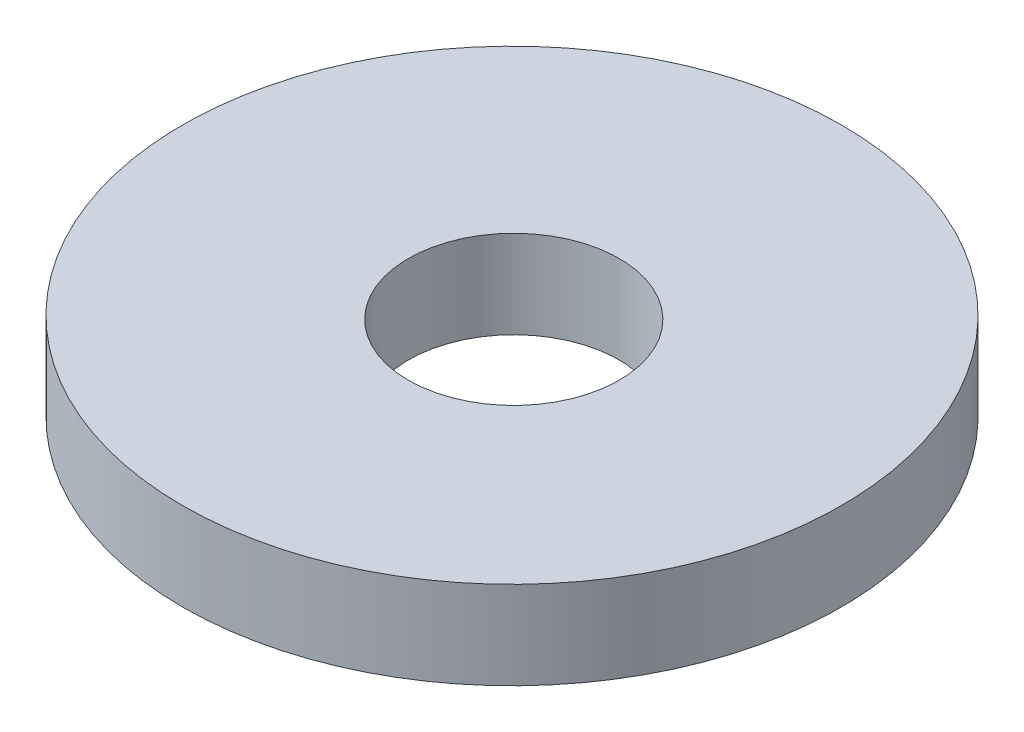
ISO-10303-21;
HEADER;
FILE_DESCRIPTION(('STEP AP214'),'2;1');
FILE_NAME('part.step','',(''),(''),'','','');
FILE_SCHEMA(('AUTOMOTIVE_DESIGN { 1 0 10303 214 1 1 1 1 }'));
ENDSEC;
DATA;
#1=APPLICATION_CONTEXT('core data for automotive mechanical design processes');
#2=APPLICATION_PROTOCOL_DEFINITION('international standard','automotive_design',2000,#1);
#3=PRODUCT_CONTEXT('',#1,'mechanical');
#4=PRODUCT('Part','Part','',(#3));
#5=PRODUCT_RELATED_PRODUCT_CATEGORY('part','',(#4));
#6=PRODUCT_DEFINITION_FORMATION('','',#4);
#7=PRODUCT_DEFINITION_CONTEXT('part definition',#1,'design');
#8=PRODUCT_DEFINITION('design','',#6,#7);
#9=PRODUCT_DEFINITION_SHAPE('','',#8);
#10=(LENGTH_UNIT() NAMED_UNIT(*) SI_UNIT(.MILLI.,.METRE.));
#11=(NAMED_UNIT(*) PLANE_ANGLE_UNIT() SI_UNIT($,.RADIAN.));
#12=(NAMED_UNIT(*) SI_UNIT($,.STERADIAN.) SOLID_ANGLE_UNIT());
#13=UNCERTAINTY_MEASURE_WITH_UNIT(LENGTH_MEASURE(1.E-05),#10,'distance_accuracy_value','');
#14=(GEOMETRIC_REPRESENTATION_CONTEXT(3) GLOBAL_UNCERTAINTY_ASSIGNED_CONTEXT((#13)) GLOBAL_UNIT_ASSIGNED_CONTEXT((#10,
#11,#12)) REPRESENTATION_CONTEXT('',''));
#15=CARTESIAN_POINT('',(0.,0.,0.));
#16=DIRECTION('',(0.,0.,1.));
#17=DIRECTION('',(1.,0.,0.));
#18=AXIS2_PLACEMENT_3D('',#15,#16,#17);
#19=CARTESIAN_POINT('',(0.,1.,0.));
#20=DIRECTION('',(0.,-1.,0.));
#21=DIRECTION('',(0.,0.,-1.));
#22=AXIS2_PLACEMENT_3D('',#19,#20,#21);
#23=CYLINDRICAL_SURFACE('',#22,3.75);
#24=CARTESIAN_POINT('',(0.,1.,0.));
#25=DIRECTION('',(0.,1.,0.));
#26=DIRECTION('',(0.,0.,1.));
#27=AXIS2_PLACEMENT_3D('',#24,#25,#26);
#28=CIRCLE('',#27,3.75);
#29=CARTESIAN_POINT('',(0.,1.,3.75));
#30=VERTEX_POINT('',#29);
#31=EDGE_CURVE('E10',#30,#30,#28,.T.);
#32=ORIENTED_EDGE('',*,*,#31,.F.);
#33=EDGE_LOOP('',(#32));
#34=FACE_BOUND('',#33,.T.);
#35=CARTESIAN_POINT('',(0.,0.,0.));
#36=DIRECTION('',(0.,1.,0.));
#37=DIRECTION('',(0.,0.,1.));
#38=AXIS2_PLACEMENT_3D('',#35,#36,#37);
#39=CIRCLE('',#38,3.75);
#40=CARTESIAN_POINT('',(0.,0.,3.75));
#41=VERTEX_POINT('',#40);
#42=EDGE_CURVE('E46',#41,#41,#39,.T.);
#43=ORIENTED_EDGE('',*,*,#42,.T.);
#44=EDGE_LOOP('',(#43));
#45=FACE_BOUND('',#44,.T.);
#46=ADVANCED_FACE('F43',(#34,#45),#23,.T.);
#47=CARTESIAN_POINT('',(0.,1.,0.));
#48=DIRECTION('',(0.,1.,0.));
#49=DIRECTION('',(0.,0.,1.));
#50=AXIS2_PLACEMENT_3D('',#47,#48,#49);
#51=PLANE('',#50);
#52=CARTESIAN_POINT('',(0.0504463944821509,1.,0.0302110607321993));
#53=DIRECTION('',(0.,1.,0.));
#54=DIRECTION('',(0.,0.,1.));
#55=AXIS2_PLACEMENT_3D('',#52,#53,#54);
#56=CIRCLE('',#55,1.19999999999999);
#57=CARTESIAN_POINT('',(0.0504463944821509,1.,1.23021106073219));
#58=VERTEX_POINT('',#57);
#59=EDGE_CURVE('E60',#58,#58,#56,.T.);
#60=ORIENTED_EDGE('',*,*,#59,.F.);
#61=EDGE_LOOP('',(#60));
#62=FACE_BOUND('',#61,.T.);
#63=ORIENTED_EDGE('',*,*,#31,.T.);
#64=EDGE_LOOP('',(#63));
#65=FACE_BOUND('',#64,.T.);
#66=ADVANCED_FACE('F67',(#62,#65),#51,.T.);
#67=CARTESIAN_POINT('',(0.,0.,0.));
#68=DIRECTION('',(0.,1.,0.));
#69=DIRECTION('',(0.,0.,1.));
#70=AXIS2_PLACEMENT_3D('',#67,#68,#69);
#71=PLANE('',#70);
#72=CARTESIAN_POINT('',(0.0504463944821509,0.,0.0302110607321993));
#73=DIRECTION('',(0.,1.,0.));
#74=DIRECTION('',(0.,0.,1.));
#75=AXIS2_PLACEMENT_3D('',#72,#73,#74);
#76=CIRCLE('',#75,1.2);
#77=CARTESIAN_POINT('',(0.0504463944821509,0.,1.2302110607322));
#78=VERTEX_POINT('',#77);
#79=EDGE_CURVE('E55',#78,#78,#76,.T.);
#80=ORIENTED_EDGE('',*,*,#79,.T.);
#81=EDGE_LOOP('',(#80));
#82=FACE_BOUND('',#81,.T.);
#83=ORIENTED_EDGE('',*,*,#42,.F.);
#84=EDGE_LOOP('',(#83));
#85=FACE_BOUND('',#84,.T.);
#86=ADVANCED_FACE('F69',(#82,#85),#71,.F.);
#87=CARTESIAN_POINT('',(0.0504463944821509,1.,0.0302110607321993));
#88=DIRECTION('',(0.,1.,0.));
#89=DIRECTION('',(0.,0.,1.));
#90=AXIS2_PLACEMENT_3D('',#87,#88,#89);
#91=CYLINDRICAL_SURFACE('',#90,1.2);
#92=ORIENTED_EDGE('',*,*,#79,.F.);
#93=EDGE_LOOP('',(#92));
#94=FACE_BOUND('',#93,.T.);
#95=ORIENTED_EDGE('',*,*,#59,.T.);
#96=EDGE_LOOP('',(#95));
#97=FACE_BOUND('',#96,.T.);
#98=ADVANCED_FACE('F65',(#94,#97),#91,.F.);
#99=CLOSED_SHELL('',(#46,#66,#86,#98));
#100=MANIFOLD_SOLID_BREP('B2',#99);
#101=ADVANCED_BREP_SHAPE_REPRESENTATION('',(#18,#100),#14);
#102=SHAPE_DEFINITION_REPRESENTATION(#9,#101);
ENDSEC;
END-ISO-10303-21;
